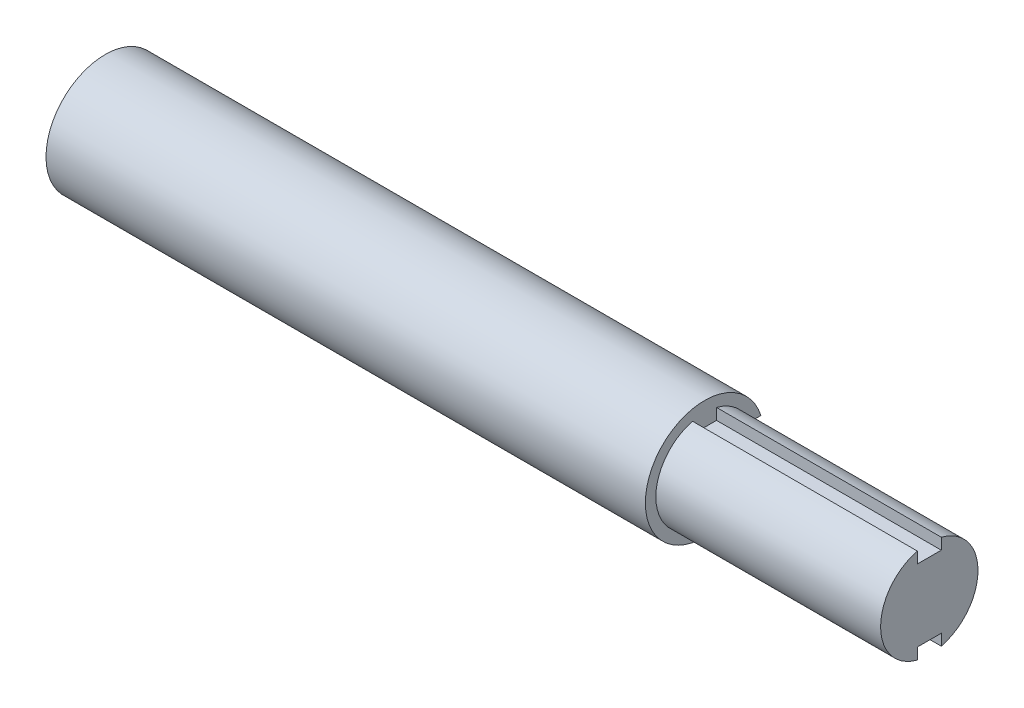
ISO-10303-21;
HEADER;
FILE_DESCRIPTION(('STEP AP214'),'2;1');
FILE_NAME('part.step','',(''),(''),'','','');
FILE_SCHEMA(('AUTOMOTIVE_DESIGN { 1 0 10303 214 1 1 1 1 }'));
ENDSEC;
DATA;
#1=APPLICATION_CONTEXT('core data for automotive mechanical design processes');
#2=APPLICATION_PROTOCOL_DEFINITION('international standard','automotive_design',2000,#1);
#3=PRODUCT_CONTEXT('',#1,'mechanical');
#4=PRODUCT('Part','Part','',(#3));
#5=PRODUCT_RELATED_PRODUCT_CATEGORY('part','',(#4));
#6=PRODUCT_DEFINITION_FORMATION('','',#4);
#7=PRODUCT_DEFINITION_CONTEXT('part definition',#1,'design');
#8=PRODUCT_DEFINITION('design','',#6,#7);
#9=PRODUCT_DEFINITION_SHAPE('','',#8);
#10=(LENGTH_UNIT() NAMED_UNIT(*) SI_UNIT(.MILLI.,.METRE.));
#11=(NAMED_UNIT(*) PLANE_ANGLE_UNIT() SI_UNIT($,.RADIAN.));
#12=(NAMED_UNIT(*) SI_UNIT($,.STERADIAN.) SOLID_ANGLE_UNIT());
#13=UNCERTAINTY_MEASURE_WITH_UNIT(LENGTH_MEASURE(1.E-05),#10,'distance_accuracy_value','');
#14=(GEOMETRIC_REPRESENTATION_CONTEXT(3) GLOBAL_UNCERTAINTY_ASSIGNED_CONTEXT((#13)) GLOBAL_UNIT_ASSIGNED_CONTEXT((#10,
#11,#12)) REPRESENTATION_CONTEXT('',''));
#15=CARTESIAN_POINT('',(0.,0.,0.));
#16=DIRECTION('',(0.,0.,1.));
#17=DIRECTION('',(1.,0.,0.));
#18=AXIS2_PLACEMENT_3D('',#15,#16,#17);
#19=CARTESIAN_POINT('',(30.,0.,0.));
#20=DIRECTION('',(-1.,0.,0.));
#21=DIRECTION('',(0.,0.,1.));
#22=AXIS2_PLACEMENT_3D('',#19,#20,#21);
#23=CYLINDRICAL_SURFACE('',#22,6.5);
#24=CARTESIAN_POINT('',(30.,0.,0.));
#25=DIRECTION('',(1.,0.,0.));
#26=DIRECTION('',(0.,0.,-1.));
#27=AXIS2_PLACEMENT_3D('',#24,#25,#26);
#28=CIRCLE('',#27,6.5);
#29=CARTESIAN_POINT('',(30.,-6.3,-1.6));
#30=VERTEX_POINT('',#29);
#31=CARTESIAN_POINT('',(30.,6.3,-1.6));
#32=VERTEX_POINT('',#31);
#33=EDGE_CURVE('E225',#30,#32,#28,.T.);
#34=ORIENTED_EDGE('',*,*,#33,.F.);
#35=DIRECTION('',(-1.,0.,0.));
#36=VECTOR('',#35,1.);
#37=CARTESIAN_POINT('',(30.,-6.3,-1.6));
#38=LINE('',#37,#36);
#39=CARTESIAN_POINT('',(0.,-6.3,-1.6));
#40=VERTEX_POINT('',#39);
#41=EDGE_CURVE('E186',#30,#40,#38,.T.);
#42=ORIENTED_EDGE('',*,*,#41,.T.);
#43=CARTESIAN_POINT('',(0.,0.,0.));
#44=DIRECTION('',(-1.,0.,0.));
#45=DIRECTION('',(0.,0.,1.));
#46=AXIS2_PLACEMENT_3D('',#43,#44,#45);
#47=CIRCLE('',#46,6.5);
#48=CARTESIAN_POINT('',(0.,-2.4,-6.04069532421558));
#49=VERTEX_POINT('',#48);
#50=EDGE_CURVE('E226',#49,#40,#47,.T.);
#51=ORIENTED_EDGE('',*,*,#50,.F.);
#52=CARTESIAN_POINT('',(0.,0.,0.));
#53=DIRECTION('',(-1.,0.,0.));
#54=DIRECTION('',(0.,0.,1.));
#55=AXIS2_PLACEMENT_3D('',#52,#53,#54);
#56=CIRCLE('',#55,6.5);
#57=CARTESIAN_POINT('',(0.,2.4,-6.04069532421558));
#58=VERTEX_POINT('',#57);
#59=EDGE_CURVE('E137',#58,#49,#56,.T.);
#60=ORIENTED_EDGE('',*,*,#59,.F.);
#61=CARTESIAN_POINT('',(0.,6.3,-1.6));
#62=VERTEX_POINT('',#61);
#63=EDGE_CURVE('E223',#62,#58,#47,.T.);
#64=ORIENTED_EDGE('',*,*,#63,.F.);
#65=DIRECTION('',(-1.,0.,0.));
#66=VECTOR('',#65,1.);
#67=CARTESIAN_POINT('',(30.,6.3,-1.6));
#68=LINE('',#67,#66);
#69=EDGE_CURVE('E209',#62,#32,#68,.F.);
#70=ORIENTED_EDGE('',*,*,#69,.T.);
#71=EDGE_LOOP('',(#34,#42,#51,#60,#64,#70));
#72=FACE_BOUND('',#71,.T.);
#73=ADVANCED_FACE('F33',(#72),#23,.T.);
#74=CARTESIAN_POINT('',(0.,-6.3,1.6));
#75=VERTEX_POINT('',#74);
#76=CARTESIAN_POINT('',(0.,6.3,1.6));
#77=VERTEX_POINT('',#76);
#78=EDGE_CURVE('E220',#75,#77,#47,.T.);
#79=ORIENTED_EDGE('',*,*,#78,.F.);
#80=DIRECTION('',(-1.,0.,0.));
#81=VECTOR('',#80,1.);
#82=CARTESIAN_POINT('',(30.,-6.3,1.6));
#83=LINE('',#82,#81);
#84=CARTESIAN_POINT('',(30.,-6.3,1.6));
#85=VERTEX_POINT('',#84);
#86=EDGE_CURVE('E182',#75,#85,#83,.F.);
#87=ORIENTED_EDGE('',*,*,#86,.T.);
#88=CARTESIAN_POINT('',(30.,6.3,1.6));
#89=VERTEX_POINT('',#88);
#90=EDGE_CURVE('E41',#89,#85,#28,.T.);
#91=ORIENTED_EDGE('',*,*,#90,.F.);
#92=DIRECTION('',(-1.,0.,0.));
#93=VECTOR('',#92,1.);
#94=CARTESIAN_POINT('',(30.,6.3,1.6));
#95=LINE('',#94,#93);
#96=EDGE_CURVE('E213',#89,#77,#95,.T.);
#97=ORIENTED_EDGE('',*,*,#96,.T.);
#98=EDGE_LOOP('',(#79,#87,#91,#97));
#99=FACE_BOUND('',#98,.T.);
#100=ADVANCED_FACE('F35',(#99),#23,.T.);
#101=CARTESIAN_POINT('',(30.,0.,0.));
#102=DIRECTION('',(1.,0.,0.));
#103=DIRECTION('',(0.,0.,-1.));
#104=AXIS2_PLACEMENT_3D('',#101,#102,#103);
#105=PLANE('',#104);
#106=DIRECTION('',(0.,1.,0.));
#107=VECTOR('',#106,1.);
#108=CARTESIAN_POINT('',(30.,-6.8,-1.6));
#109=LINE('',#108,#107);
#110=CARTESIAN_POINT('',(30.,-4.8,-1.6));
#111=VERTEX_POINT('',#110);
#112=EDGE_CURVE('E166',#30,#111,#109,.T.);
#113=ORIENTED_EDGE('',*,*,#112,.F.);
#114=ORIENTED_EDGE('',*,*,#33,.T.);
#115=DIRECTION('',(0.,1.,0.));
#116=VECTOR('',#115,1.);
#117=CARTESIAN_POINT('',(30.,6.8,-1.6));
#118=LINE('',#117,#116);
#119=CARTESIAN_POINT('',(30.,4.8,-1.6));
#120=VERTEX_POINT('',#119);
#121=EDGE_CURVE('E193',#120,#32,#118,.T.);
#122=ORIENTED_EDGE('',*,*,#121,.F.);
#123=DIRECTION('',(0.,0.,-1.));
#124=VECTOR('',#123,1.);
#125=CARTESIAN_POINT('',(30.,4.8,1.6));
#126=LINE('',#125,#124);
#127=CARTESIAN_POINT('',(30.,4.8,1.6));
#128=VERTEX_POINT('',#127);
#129=EDGE_CURVE('E202',#128,#120,#126,.T.);
#130=ORIENTED_EDGE('',*,*,#129,.F.);
#131=DIRECTION('',(0.,-1.,0.));
#132=VECTOR('',#131,1.);
#133=CARTESIAN_POINT('',(30.,6.8,1.6));
#134=LINE('',#133,#132);
#135=EDGE_CURVE('E189',#89,#128,#134,.T.);
#136=ORIENTED_EDGE('',*,*,#135,.F.);
#137=ORIENTED_EDGE('',*,*,#90,.T.);
#138=DIRECTION('',(0.,-1.,0.));
#139=VECTOR('',#138,1.);
#140=CARTESIAN_POINT('',(30.,-6.8,1.6));
#141=LINE('',#140,#139);
#142=CARTESIAN_POINT('',(30.,-4.8,1.6));
#143=VERTEX_POINT('',#142);
#144=EDGE_CURVE('E170',#143,#85,#141,.T.);
#145=ORIENTED_EDGE('',*,*,#144,.F.);
#146=DIRECTION('',(0.,0.,1.));
#147=VECTOR('',#146,1.);
#148=CARTESIAN_POINT('',(30.,-4.8,-1.6));
#149=LINE('',#148,#147);
#150=EDGE_CURVE('E177',#111,#143,#149,.T.);
#151=ORIENTED_EDGE('',*,*,#150,.F.);
#152=EDGE_LOOP('',(#113,#114,#122,#130,#136,#137,#145,#151));
#153=FACE_BOUND('',#152,.T.);
#154=ADVANCED_FACE('F235',(#153),#105,.T.);
#155=CARTESIAN_POINT('',(0.,0.,0.));
#156=DIRECTION('',(-1.,0.,0.));
#157=DIRECTION('',(0.,0.,1.));
#158=AXIS2_PLACEMENT_3D('',#155,#156,#157);
#159=PLANE('',#158);
#160=ORIENTED_EDGE('',*,*,#63,.T.);
#161=DIRECTION('',(0.,0.,-1.));
#162=VECTOR('',#161,1.);
#163=CARTESIAN_POINT('',(0.,2.4,-8.12661942707349));
#164=LINE('',#163,#162);
#165=CARTESIAN_POINT('',(0.,2.4,-7.52661942707349));
#166=VERTEX_POINT('',#165);
#167=EDGE_CURVE('E152',#58,#166,#164,.T.);
#168=ORIENTED_EDGE('',*,*,#167,.T.);
#169=CARTESIAN_POINT('',(0.,0.,0.));
#170=DIRECTION('',(-1.,0.,0.));
#171=DIRECTION('',(0.,0.,1.));
#172=AXIS2_PLACEMENT_3D('',#169,#170,#171);
#173=CIRCLE('',#172,7.9);
#174=CARTESIAN_POINT('',(0.,-2.4,-7.52661942707349));
#175=VERTEX_POINT('',#174);
#176=EDGE_CURVE('E216',#175,#166,#173,.T.);
#177=ORIENTED_EDGE('',*,*,#176,.F.);
#178=DIRECTION('',(0.,0.,1.));
#179=VECTOR('',#178,1.);
#180=CARTESIAN_POINT('',(0.,-2.4,-8.12661942707349));
#181=LINE('',#180,#179);
#182=EDGE_CURVE('E139',#175,#49,#181,.T.);
#183=ORIENTED_EDGE('',*,*,#182,.T.);
#184=ORIENTED_EDGE('',*,*,#50,.T.);
#185=DIRECTION('',(0.,1.,0.));
#186=VECTOR('',#185,1.);
#187=CARTESIAN_POINT('',(0.,-6.8,-1.6));
#188=LINE('',#187,#186);
#189=CARTESIAN_POINT('',(0.,-4.8,-1.6));
#190=VERTEX_POINT('',#189);
#191=EDGE_CURVE('E167',#40,#190,#188,.T.);
#192=ORIENTED_EDGE('',*,*,#191,.T.);
#193=DIRECTION('',(0.,0.,1.));
#194=VECTOR('',#193,1.);
#195=CARTESIAN_POINT('',(0.,-4.8,-1.6));
#196=LINE('',#195,#194);
#197=CARTESIAN_POINT('',(0.,-4.8,1.6));
#198=VERTEX_POINT('',#197);
#199=EDGE_CURVE('E169',#190,#198,#196,.T.);
#200=ORIENTED_EDGE('',*,*,#199,.T.);
#201=DIRECTION('',(0.,-1.,0.));
#202=VECTOR('',#201,1.);
#203=CARTESIAN_POINT('',(0.,-6.8,1.6));
#204=LINE('',#203,#202);
#205=EDGE_CURVE('E173',#198,#75,#204,.T.);
#206=ORIENTED_EDGE('',*,*,#205,.T.);
#207=ORIENTED_EDGE('',*,*,#78,.T.);
#208=DIRECTION('',(0.,-1.,0.));
#209=VECTOR('',#208,1.);
#210=CARTESIAN_POINT('',(0.,6.8,1.6));
#211=LINE('',#210,#209);
#212=CARTESIAN_POINT('',(0.,4.8,1.6));
#213=VERTEX_POINT('',#212);
#214=EDGE_CURVE('E190',#77,#213,#211,.T.);
#215=ORIENTED_EDGE('',*,*,#214,.T.);
#216=DIRECTION('',(0.,0.,-1.));
#217=VECTOR('',#216,1.);
#218=CARTESIAN_POINT('',(0.,4.8,1.6));
#219=LINE('',#218,#217);
#220=CARTESIAN_POINT('',(0.,4.8,-1.6));
#221=VERTEX_POINT('',#220);
#222=EDGE_CURVE('E192',#213,#221,#219,.T.);
#223=ORIENTED_EDGE('',*,*,#222,.T.);
#224=DIRECTION('',(0.,1.,0.));
#225=VECTOR('',#224,1.);
#226=CARTESIAN_POINT('',(0.,6.8,-1.6));
#227=LINE('',#226,#225);
#228=EDGE_CURVE('E196',#221,#62,#227,.T.);
#229=ORIENTED_EDGE('',*,*,#228,.T.);
#230=EDGE_LOOP('',(#160,#168,#177,#183,#184,#192,#200,#206,#207,#215,#223,#229));
#231=FACE_BOUND('',#230,.T.);
#232=ADVANCED_FACE('F245',(#231),#159,.F.);
#233=CARTESIAN_POINT('',(-80.,0.,0.));
#234=DIRECTION('',(1.,0.,0.));
#235=DIRECTION('',(0.,0.,-1.));
#236=AXIS2_PLACEMENT_3D('',#233,#234,#235);
#237=CYLINDRICAL_SURFACE('',#236,7.9);
#238=ORIENTED_EDGE('',*,*,#176,.T.);
#239=DIRECTION('',(1.,0.,0.));
#240=VECTOR('',#239,1.);
#241=CARTESIAN_POINT('',(-80.,2.4,-7.52661942707349));
#242=LINE('',#241,#240);
#243=CARTESIAN_POINT('',(-80.,2.4,-7.52661942707349));
#244=VERTEX_POINT('',#243);
#245=EDGE_CURVE('E162',#166,#244,#242,.F.);
#246=ORIENTED_EDGE('',*,*,#245,.T.);
#247=CARTESIAN_POINT('',(-80.,0.,0.));
#248=DIRECTION('',(-1.,0.,0.));
#249=DIRECTION('',(0.,0.,1.));
#250=AXIS2_PLACEMENT_3D('',#247,#248,#249);
#251=CIRCLE('',#250,7.9);
#252=CARTESIAN_POINT('',(-80.,-2.4,-7.52661942707349));
#253=VERTEX_POINT('',#252);
#254=EDGE_CURVE('E217',#253,#244,#251,.T.);
#255=ORIENTED_EDGE('',*,*,#254,.F.);
#256=DIRECTION('',(1.,0.,0.));
#257=VECTOR('',#256,1.);
#258=CARTESIAN_POINT('',(-80.,-2.4,-7.52661942707349));
#259=LINE('',#258,#257);
#260=EDGE_CURVE('E47',#253,#175,#259,.T.);
#261=ORIENTED_EDGE('',*,*,#260,.T.);
#262=EDGE_LOOP('',(#238,#246,#255,#261));
#263=FACE_BOUND('',#262,.T.);
#264=ADVANCED_FACE('F281',(#263),#237,.T.);
#265=CARTESIAN_POINT('',(-80.,0.,0.));
#266=DIRECTION('',(-1.,0.,0.));
#267=DIRECTION('',(0.,0.,1.));
#268=AXIS2_PLACEMENT_3D('',#265,#266,#267);
#269=PLANE('',#268);
#270=DIRECTION('',(0.,0.,-1.));
#271=VECTOR('',#270,1.);
#272=CARTESIAN_POINT('',(-80.,2.4,-8.12661942707349));
#273=LINE('',#272,#271);
#274=CARTESIAN_POINT('',(-80.,2.4,-5.12661942707349));
#275=VERTEX_POINT('',#274);
#276=EDGE_CURVE('E140',#275,#244,#273,.T.);
#277=ORIENTED_EDGE('',*,*,#276,.F.);
#278=DIRECTION('',(0.,1.,0.));
#279=VECTOR('',#278,1.);
#280=CARTESIAN_POINT('',(-80.,2.4,-5.12661942707349));
#281=LINE('',#280,#279);
#282=CARTESIAN_POINT('',(-80.,-2.4,-5.12661942707349));
#283=VERTEX_POINT('',#282);
#284=EDGE_CURVE('E157',#283,#275,#281,.T.);
#285=ORIENTED_EDGE('',*,*,#284,.F.);
#286=DIRECTION('',(0.,0.,1.));
#287=VECTOR('',#286,1.);
#288=CARTESIAN_POINT('',(-80.,-2.4,0.));
#289=LINE('',#288,#287);
#290=EDGE_CURVE('E11',#253,#283,#289,.T.);
#291=ORIENTED_EDGE('',*,*,#290,.F.);
#292=ORIENTED_EDGE('',*,*,#254,.T.);
#293=EDGE_LOOP('',(#277,#285,#291,#292));
#294=FACE_BOUND('',#293,.T.);
#295=ADVANCED_FACE('F285',(#294),#269,.T.);
#296=CARTESIAN_POINT('',(0.,6.8,1.6));
#297=DIRECTION('',(0.,0.,1.));
#298=DIRECTION('',(0.,-1.,0.));
#299=AXIS2_PLACEMENT_3D('',#296,#297,#298);
#300=PLANE('',#299);
#301=ORIENTED_EDGE('',*,*,#135,.T.);
#302=DIRECTION('',(1.,0.,0.));
#303=VECTOR('',#302,1.);
#304=CARTESIAN_POINT('',(0.,4.8,1.6));
#305=LINE('',#304,#303);
#306=EDGE_CURVE('E199',#213,#128,#305,.T.);
#307=ORIENTED_EDGE('',*,*,#306,.F.);
#308=ORIENTED_EDGE('',*,*,#214,.F.);
#309=ORIENTED_EDGE('',*,*,#96,.F.);
#310=EDGE_LOOP('',(#301,#307,#308,#309));
#311=FACE_BOUND('',#310,.T.);
#312=ADVANCED_FACE('F290',(#311),#300,.F.);
#313=CARTESIAN_POINT('',(0.,6.8,-1.6));
#314=DIRECTION('',(0.,0.,-1.));
#315=DIRECTION('',(0.,1.,0.));
#316=AXIS2_PLACEMENT_3D('',#313,#314,#315);
#317=PLANE('',#316);
#318=ORIENTED_EDGE('',*,*,#228,.F.);
#319=DIRECTION('',(1.,0.,0.));
#320=VECTOR('',#319,1.);
#321=CARTESIAN_POINT('',(0.,4.8,-1.6));
#322=LINE('',#321,#320);
#323=EDGE_CURVE('E207',#221,#120,#322,.T.);
#324=ORIENTED_EDGE('',*,*,#323,.T.);
#325=ORIENTED_EDGE('',*,*,#121,.T.);
#326=ORIENTED_EDGE('',*,*,#69,.F.);
#327=EDGE_LOOP('',(#318,#324,#325,#326));
#328=FACE_BOUND('',#327,.T.);
#329=ADVANCED_FACE('F241',(#328),#317,.F.);
#330=CARTESIAN_POINT('',(0.,4.8,1.6));
#331=DIRECTION('',(0.,-1.,0.));
#332=DIRECTION('',(0.,0.,-1.));
#333=AXIS2_PLACEMENT_3D('',#330,#331,#332);
#334=PLANE('',#333);
#335=ORIENTED_EDGE('',*,*,#129,.T.);
#336=ORIENTED_EDGE('',*,*,#323,.F.);
#337=ORIENTED_EDGE('',*,*,#222,.F.);
#338=ORIENTED_EDGE('',*,*,#306,.T.);
#339=EDGE_LOOP('',(#335,#336,#337,#338));
#340=FACE_BOUND('',#339,.T.);
#341=ADVANCED_FACE('F251',(#340),#334,.F.);
#342=CARTESIAN_POINT('',(0.,-6.8,-1.6));
#343=DIRECTION('',(0.,0.,-1.));
#344=DIRECTION('',(0.,1.,0.));
#345=AXIS2_PLACEMENT_3D('',#342,#343,#344);
#346=PLANE('',#345);
#347=ORIENTED_EDGE('',*,*,#112,.T.);
#348=DIRECTION('',(1.,0.,0.));
#349=VECTOR('',#348,1.);
#350=CARTESIAN_POINT('',(0.,-4.8,-1.6));
#351=LINE('',#350,#349);
#352=EDGE_CURVE('E55',#190,#111,#351,.T.);
#353=ORIENTED_EDGE('',*,*,#352,.F.);
#354=ORIENTED_EDGE('',*,*,#191,.F.);
#355=ORIENTED_EDGE('',*,*,#41,.F.);
#356=EDGE_LOOP('',(#347,#353,#354,#355));
#357=FACE_BOUND('',#356,.T.);
#358=ADVANCED_FACE('F268',(#357),#346,.F.);
#359=CARTESIAN_POINT('',(0.,-6.8,1.6));
#360=DIRECTION('',(0.,0.,1.));
#361=DIRECTION('',(0.,-1.,0.));
#362=AXIS2_PLACEMENT_3D('',#359,#360,#361);
#363=PLANE('',#362);
#364=ORIENTED_EDGE('',*,*,#205,.F.);
#365=DIRECTION('',(1.,0.,0.));
#366=VECTOR('',#365,1.);
#367=CARTESIAN_POINT('',(0.,-4.8,1.6));
#368=LINE('',#367,#366);
#369=EDGE_CURVE('E180',#198,#143,#368,.T.);
#370=ORIENTED_EDGE('',*,*,#369,.T.);
#371=ORIENTED_EDGE('',*,*,#144,.T.);
#372=ORIENTED_EDGE('',*,*,#86,.F.);
#373=EDGE_LOOP('',(#364,#370,#371,#372));
#374=FACE_BOUND('',#373,.T.);
#375=ADVANCED_FACE('F257',(#374),#363,.F.);
#376=CARTESIAN_POINT('',(0.,-4.8,-1.6));
#377=DIRECTION('',(0.,1.,0.));
#378=DIRECTION('',(0.,0.,1.));
#379=AXIS2_PLACEMENT_3D('',#376,#377,#378);
#380=PLANE('',#379);
#381=ORIENTED_EDGE('',*,*,#150,.T.);
#382=ORIENTED_EDGE('',*,*,#369,.F.);
#383=ORIENTED_EDGE('',*,*,#199,.F.);
#384=ORIENTED_EDGE('',*,*,#352,.T.);
#385=EDGE_LOOP('',(#381,#382,#383,#384));
#386=FACE_BOUND('',#385,.T.);
#387=ADVANCED_FACE('F259',(#386),#380,.F.);
#388=CARTESIAN_POINT('',(0.,0.,0.));
#389=DIRECTION('',(-1.,0.,0.));
#390=DIRECTION('',(0.,0.,1.));
#391=AXIS2_PLACEMENT_3D('',#388,#389,#390);
#392=PLANE('',#391);
#393=ORIENTED_EDGE('',*,*,#59,.T.);
#394=CARTESIAN_POINT('',(0.,-2.4,-5.12661942707349));
#395=VERTEX_POINT('',#394);
#396=EDGE_CURVE('E129',#49,#395,#181,.T.);
#397=ORIENTED_EDGE('',*,*,#396,.T.);
#398=DIRECTION('',(0.,1.,0.));
#399=VECTOR('',#398,1.);
#400=CARTESIAN_POINT('',(0.,2.4,-5.12661942707349));
#401=LINE('',#400,#399);
#402=CARTESIAN_POINT('',(0.,2.4,-5.12661942707349));
#403=VERTEX_POINT('',#402);
#404=EDGE_CURVE('E134',#395,#403,#401,.T.);
#405=ORIENTED_EDGE('',*,*,#404,.T.);
#406=EDGE_CURVE('E149',#403,#58,#164,.T.);
#407=ORIENTED_EDGE('',*,*,#406,.T.);
#408=EDGE_LOOP('',(#393,#397,#405,#407));
#409=FACE_BOUND('',#408,.T.);
#410=ADVANCED_FACE('F131',(#409),#392,.T.);
#411=CARTESIAN_POINT('',(0.,2.4,-8.12661942707349));
#412=DIRECTION('',(0.,1.,0.));
#413=DIRECTION('',(0.,0.,1.));
#414=AXIS2_PLACEMENT_3D('',#411,#412,#413);
#415=PLANE('',#414);
#416=ORIENTED_EDGE('',*,*,#167,.F.);
#417=ORIENTED_EDGE('',*,*,#406,.F.);
#418=DIRECTION('',(-1.,0.,0.));
#419=VECTOR('',#418,1.);
#420=CARTESIAN_POINT('',(0.,2.4,-5.12661942707349));
#421=LINE('',#420,#419);
#422=EDGE_CURVE('E148',#403,#275,#421,.T.);
#423=ORIENTED_EDGE('',*,*,#422,.T.);
#424=ORIENTED_EDGE('',*,*,#276,.T.);
#425=ORIENTED_EDGE('',*,*,#245,.F.);
#426=EDGE_LOOP('',(#416,#417,#423,#424,#425));
#427=FACE_BOUND('',#426,.T.);
#428=ADVANCED_FACE('F266',(#427),#415,.F.);
#429=CARTESIAN_POINT('',(0.,-2.4,-8.12661942707349));
#430=DIRECTION('',(0.,-1.,0.));
#431=DIRECTION('',(0.,0.,-1.));
#432=AXIS2_PLACEMENT_3D('',#429,#430,#431);
#433=PLANE('',#432);
#434=ORIENTED_EDGE('',*,*,#290,.T.);
#435=DIRECTION('',(-1.,0.,0.));
#436=VECTOR('',#435,1.);
#437=CARTESIAN_POINT('',(0.,-2.4,-5.12661942707349));
#438=LINE('',#437,#436);
#439=EDGE_CURVE('E143',#395,#283,#438,.T.);
#440=ORIENTED_EDGE('',*,*,#439,.F.);
#441=ORIENTED_EDGE('',*,*,#396,.F.);
#442=ORIENTED_EDGE('',*,*,#182,.F.);
#443=ORIENTED_EDGE('',*,*,#260,.F.);
#444=EDGE_LOOP('',(#434,#440,#441,#442,#443));
#445=FACE_BOUND('',#444,.T.);
#446=ADVANCED_FACE('F144',(#445),#433,.F.);
#447=CARTESIAN_POINT('',(0.,2.4,-5.12661942707349));
#448=DIRECTION('',(0.,0.,1.));
#449=DIRECTION('',(0.,-1.,0.));
#450=AXIS2_PLACEMENT_3D('',#447,#448,#449);
#451=PLANE('',#450);
#452=ORIENTED_EDGE('',*,*,#284,.T.);
#453=ORIENTED_EDGE('',*,*,#422,.F.);
#454=ORIENTED_EDGE('',*,*,#404,.F.);
#455=ORIENTED_EDGE('',*,*,#439,.T.);
#456=EDGE_LOOP('',(#452,#453,#454,#455));
#457=FACE_BOUND('',#456,.T.);
#458=ADVANCED_FACE('F151',(#457),#451,.F.);
#459=CLOSED_SHELL('',(#73,#100,#154,#232,#264,#295,#312,#329,#341,#358,#375,#387,#410,#428,#446,#458));
#460=MANIFOLD_SOLID_BREP('B2',#459);
#461=ADVANCED_BREP_SHAPE_REPRESENTATION('',(#18,#460),#14);
#462=SHAPE_DEFINITION_REPRESENTATION(#9,#461);
ENDSEC;
END-ISO-10303-21;
